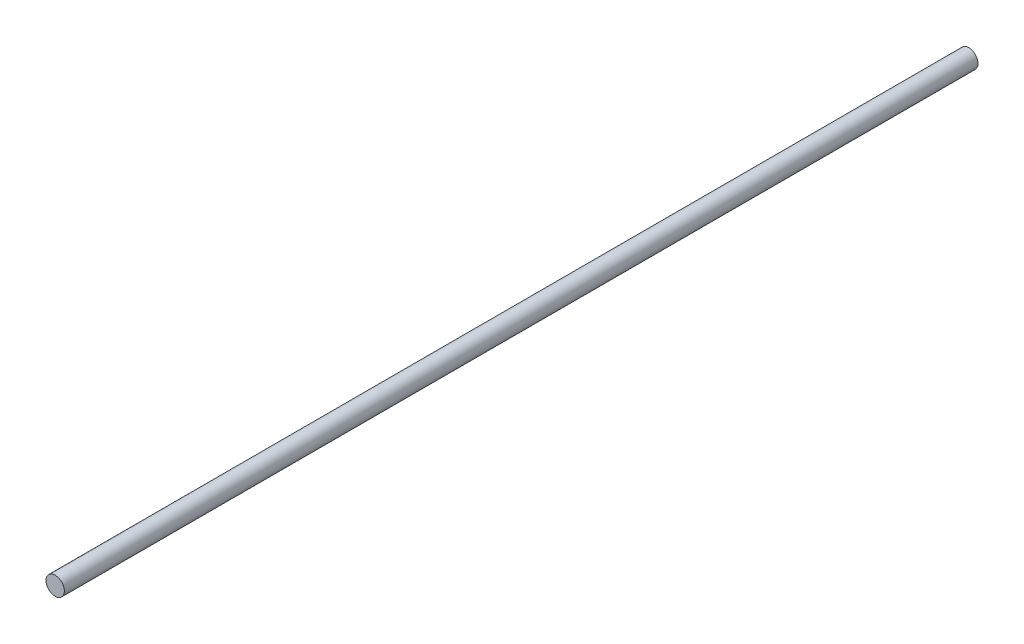
ISO-10303-21;
HEADER;
FILE_DESCRIPTION(('STEP AP214'),'2;1');
FILE_NAME('part.step','',(''),(''),'','','');
FILE_SCHEMA(('AUTOMOTIVE_DESIGN { 1 0 10303 214 1 1 1 1 }'));
ENDSEC;
DATA;
#1=APPLICATION_CONTEXT('core data for automotive mechanical design processes');
#2=APPLICATION_PROTOCOL_DEFINITION('international standard','automotive_design',2000,#1);
#3=PRODUCT_CONTEXT('',#1,'mechanical');
#4=PRODUCT('Part','Part','',(#3));
#5=PRODUCT_RELATED_PRODUCT_CATEGORY('part','',(#4));
#6=PRODUCT_DEFINITION_FORMATION('','',#4);
#7=PRODUCT_DEFINITION_CONTEXT('part definition',#1,'design');
#8=PRODUCT_DEFINITION('design','',#6,#7);
#9=PRODUCT_DEFINITION_SHAPE('','',#8);
#10=(LENGTH_UNIT() NAMED_UNIT(*) SI_UNIT(.MILLI.,.METRE.));
#11=(NAMED_UNIT(*) PLANE_ANGLE_UNIT() SI_UNIT($,.RADIAN.));
#12=(NAMED_UNIT(*) SI_UNIT($,.STERADIAN.) SOLID_ANGLE_UNIT());
#13=UNCERTAINTY_MEASURE_WITH_UNIT(LENGTH_MEASURE(1.E-05),#10,'distance_accuracy_value','');
#14=(GEOMETRIC_REPRESENTATION_CONTEXT(3) GLOBAL_UNCERTAINTY_ASSIGNED_CONTEXT((#13)) GLOBAL_UNIT_ASSIGNED_CONTEXT((#10,
#11,#12)) REPRESENTATION_CONTEXT('',''));
#15=CARTESIAN_POINT('',(0.,0.,0.));
#16=DIRECTION('',(0.,0.,1.));
#17=DIRECTION('',(1.,0.,0.));
#18=AXIS2_PLACEMENT_3D('',#15,#16,#17);
#19=CARTESIAN_POINT('',(0.,0.,598.));
#20=DIRECTION('',(0.,0.,-1.));
#21=DIRECTION('',(-1.,0.,0.));
#22=AXIS2_PLACEMENT_3D('',#19,#20,#21);
#23=CYLINDRICAL_SURFACE('',#22,6.);
#24=CARTESIAN_POINT('',(0.,0.,598.));
#25=DIRECTION('',(0.,0.,1.));
#26=DIRECTION('',(1.,0.,0.));
#27=AXIS2_PLACEMENT_3D('',#24,#25,#26);
#28=CIRCLE('',#27,6.);
#29=CARTESIAN_POINT('',(6.,0.,598.));
#30=VERTEX_POINT('',#29);
#31=EDGE_CURVE('E10',#30,#30,#28,.T.);
#32=ORIENTED_EDGE('',*,*,#31,.F.);
#33=EDGE_LOOP('',(#32));
#34=FACE_BOUND('',#33,.T.);
#35=CARTESIAN_POINT('',(0.,0.,0.));
#36=DIRECTION('',(0.,0.,1.));
#37=DIRECTION('',(1.,0.,0.));
#38=AXIS2_PLACEMENT_3D('',#35,#36,#37);
#39=CIRCLE('',#38,6.);
#40=CARTESIAN_POINT('',(6.,0.,0.));
#41=VERTEX_POINT('',#40);
#42=EDGE_CURVE('E34',#41,#41,#39,.T.);
#43=ORIENTED_EDGE('',*,*,#42,.T.);
#44=EDGE_LOOP('',(#43));
#45=FACE_BOUND('',#44,.T.);
#46=ADVANCED_FACE('F31',(#34,#45),#23,.T.);
#47=CARTESIAN_POINT('',(0.,0.,598.));
#48=DIRECTION('',(0.,0.,1.));
#49=DIRECTION('',(1.,0.,0.));
#50=AXIS2_PLACEMENT_3D('',#47,#48,#49);
#51=PLANE('',#50);
#52=ORIENTED_EDGE('',*,*,#31,.T.);
#53=EDGE_LOOP('',(#52));
#54=FACE_BOUND('',#53,.T.);
#55=ADVANCED_FACE('F46',(#54),#51,.T.);
#56=CARTESIAN_POINT('',(0.,0.,0.));
#57=DIRECTION('',(0.,0.,1.));
#58=DIRECTION('',(1.,0.,0.));
#59=AXIS2_PLACEMENT_3D('',#56,#57,#58);
#60=PLANE('',#59);
#61=ORIENTED_EDGE('',*,*,#42,.F.);
#62=EDGE_LOOP('',(#61));
#63=FACE_BOUND('',#62,.T.);
#64=ADVANCED_FACE('F44',(#63),#60,.F.);
#65=CLOSED_SHELL('',(#46,#55,#64));
#66=MANIFOLD_SOLID_BREP('B2',#65);
#67=ADVANCED_BREP_SHAPE_REPRESENTATION('',(#18,#66),#14);
#68=SHAPE_DEFINITION_REPRESENTATION(#9,#67);
ENDSEC;
END-ISO-10303-21;
